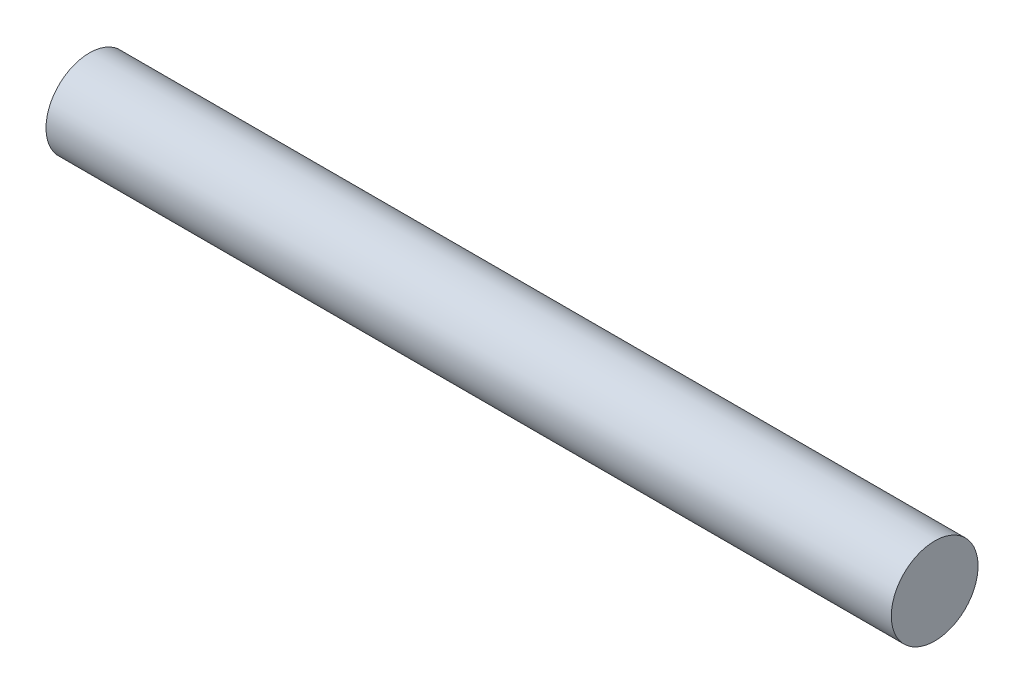
ISO-10303-21;
HEADER;
FILE_DESCRIPTION(('STEP AP214'),'2;1');
FILE_NAME('part.step','',(''),(''),'','','');
FILE_SCHEMA(('AUTOMOTIVE_DESIGN { 1 0 10303 214 1 1 1 1 }'));
ENDSEC;
DATA;
#1=APPLICATION_CONTEXT('core data for automotive mechanical design processes');
#2=APPLICATION_PROTOCOL_DEFINITION('international standard','automotive_design',2000,#1);
#3=PRODUCT_CONTEXT('',#1,'mechanical');
#4=PRODUCT('Part','Part','',(#3));
#5=PRODUCT_RELATED_PRODUCT_CATEGORY('part','',(#4));
#6=PRODUCT_DEFINITION_FORMATION('','',#4);
#7=PRODUCT_DEFINITION_CONTEXT('part definition',#1,'design');
#8=PRODUCT_DEFINITION('design','',#6,#7);
#9=PRODUCT_DEFINITION_SHAPE('','',#8);
#10=(LENGTH_UNIT() NAMED_UNIT(*) SI_UNIT(.MILLI.,.METRE.));
#11=(NAMED_UNIT(*) PLANE_ANGLE_UNIT() SI_UNIT($,.RADIAN.));
#12=(NAMED_UNIT(*) SI_UNIT($,.STERADIAN.) SOLID_ANGLE_UNIT());
#13=UNCERTAINTY_MEASURE_WITH_UNIT(LENGTH_MEASURE(1.E-05),#10,'distance_accuracy_value','');
#14=(GEOMETRIC_REPRESENTATION_CONTEXT(3) GLOBAL_UNCERTAINTY_ASSIGNED_CONTEXT((#13)) GLOBAL_UNIT_ASSIGNED_CONTEXT((#10,
#11,#12)) REPRESENTATION_CONTEXT('',''));
#15=CARTESIAN_POINT('',(0.,0.,0.));
#16=DIRECTION('',(0.,0.,1.));
#17=DIRECTION('',(1.,0.,0.));
#18=AXIS2_PLACEMENT_3D('',#15,#16,#17);
#19=CARTESIAN_POINT('',(0.,0.,0.));
#20=DIRECTION('',(1.,0.,0.));
#21=DIRECTION('',(0.,0.,-1.));
#22=AXIS2_PLACEMENT_3D('',#19,#20,#21);
#23=PLANE('',#22);
#24=CARTESIAN_POINT('',(0.,0.,0.));
#25=DIRECTION('',(1.,0.,0.));
#26=DIRECTION('',(0.,0.,-1.));
#27=AXIS2_PLACEMENT_3D('',#24,#25,#26);
#28=CIRCLE('',#27,3.57);
#29=CARTESIAN_POINT('',(0.,0.,-3.57));
#30=VERTEX_POINT('',#29);
#31=EDGE_CURVE('E42',#30,#30,#28,.T.);
#32=ORIENTED_EDGE('',*,*,#31,.F.);
#33=EDGE_LOOP('',(#32));
#34=FACE_BOUND('',#33,.T.);
#35=ADVANCED_FACE('F35',(#34),#23,.F.);
#36=CARTESIAN_POINT('',(79.6444285549025,0.,0.));
#37=DIRECTION('',(-1.,0.,0.));
#38=DIRECTION('',(0.,0.,1.));
#39=AXIS2_PLACEMENT_3D('',#36,#37,#38);
#40=CYLINDRICAL_SURFACE('',#39,3.57);
#41=CARTESIAN_POINT('',(69.5469437195584,0.,0.));
#42=DIRECTION('',(-1.,0.,0.));
#43=DIRECTION('',(0.,0.,1.));
#44=AXIS2_PLACEMENT_3D('',#41,#42,#43);
#45=CIRCLE('',#44,3.57);
#46=CARTESIAN_POINT('',(69.5469437195584,0.,3.57));
#47=VERTEX_POINT('',#46);
#48=EDGE_CURVE('E10',#47,#47,#45,.T.);
#49=ORIENTED_EDGE('',*,*,#48,.T.);
#50=EDGE_LOOP('',(#49));
#51=FACE_BOUND('',#50,.T.);
#52=ORIENTED_EDGE('',*,*,#31,.T.);
#53=EDGE_LOOP('',(#52));
#54=FACE_BOUND('',#53,.T.);
#55=ADVANCED_FACE('F37',(#51,#54),#40,.T.);
#56=CARTESIAN_POINT('',(69.5469437195584,-3.57187475360126,0.00132672936831179));
#57=DIRECTION('',(-1.,0.,0.));
#58=DIRECTION('',(0.,-0.000371437793376357,-0.999999931016981));
#59=AXIS2_PLACEMENT_3D('',#56,#57,#58);
#60=PLANE('',#59);
#61=ORIENTED_EDGE('',*,*,#48,.F.);
#62=EDGE_LOOP('',(#61));
#63=FACE_BOUND('',#62,.T.);
#64=ADVANCED_FACE('F53',(#63),#60,.F.);
#65=CLOSED_SHELL('',(#35,#55,#64));
#66=MANIFOLD_SOLID_BREP('B2',#65);
#67=ADVANCED_BREP_SHAPE_REPRESENTATION('',(#18,#66),#14);
#68=SHAPE_DEFINITION_REPRESENTATION(#9,#67);
ENDSEC;
END-ISO-10303-21;
